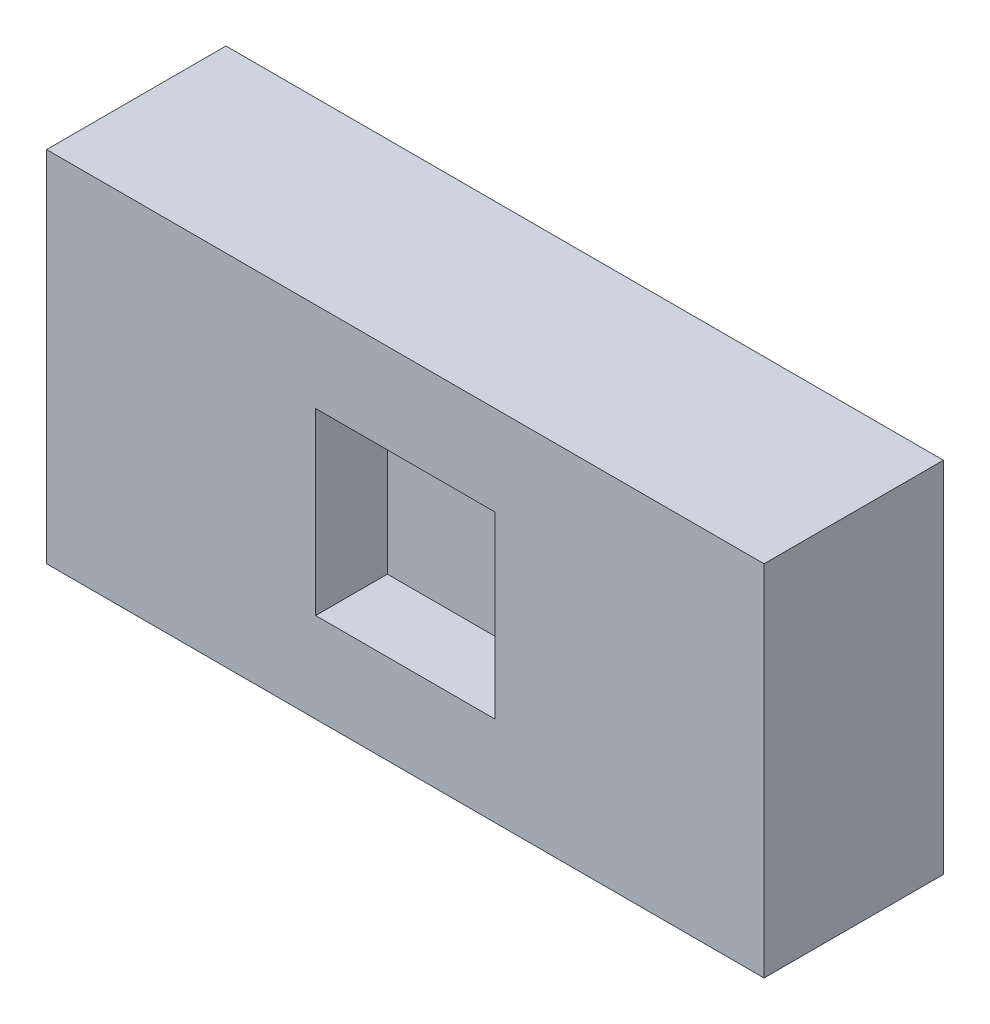
ISO-10303-21;
HEADER;
FILE_DESCRIPTION(('STEP AP214'),'2;1');
FILE_NAME('part.step','',(''),(''),'','','');
FILE_SCHEMA(('AUTOMOTIVE_DESIGN { 1 0 10303 214 1 1 1 1 }'));
ENDSEC;
DATA;
#1=APPLICATION_CONTEXT('core data for automotive mechanical design processes');
#2=APPLICATION_PROTOCOL_DEFINITION('international standard','automotive_design',2000,#1);
#3=PRODUCT_CONTEXT('',#1,'mechanical');
#4=PRODUCT('Part','Part','',(#3));
#5=PRODUCT_RELATED_PRODUCT_CATEGORY('part','',(#4));
#6=PRODUCT_DEFINITION_FORMATION('','',#4);
#7=PRODUCT_DEFINITION_CONTEXT('part definition',#1,'design');
#8=PRODUCT_DEFINITION('design','',#6,#7);
#9=PRODUCT_DEFINITION_SHAPE('','',#8);
#10=(LENGTH_UNIT() NAMED_UNIT(*) SI_UNIT(.MILLI.,.METRE.));
#11=(NAMED_UNIT(*) PLANE_ANGLE_UNIT() SI_UNIT($,.RADIAN.));
#12=(NAMED_UNIT(*) SI_UNIT($,.STERADIAN.) SOLID_ANGLE_UNIT());
#13=UNCERTAINTY_MEASURE_WITH_UNIT(LENGTH_MEASURE(1.E-05),#10,'distance_accuracy_value','');
#14=(GEOMETRIC_REPRESENTATION_CONTEXT(3) GLOBAL_UNCERTAINTY_ASSIGNED_CONTEXT((#13)) GLOBAL_UNIT_ASSIGNED_CONTEXT((#10,
#11,#12)) REPRESENTATION_CONTEXT('',''));
#15=CARTESIAN_POINT('',(0.,0.,0.));
#16=DIRECTION('',(0.,0.,1.));
#17=DIRECTION('',(1.,0.,0.));
#18=AXIS2_PLACEMENT_3D('',#15,#16,#17);
#19=CARTESIAN_POINT('',(0.,0.,10.));
#20=DIRECTION('',(1.,0.,0.));
#21=DIRECTION('',(0.,0.,-1.));
#22=AXIS2_PLACEMENT_3D('',#19,#20,#21);
#23=PLANE('',#22);
#24=DIRECTION('',(0.,-1.,0.));
#25=VECTOR('',#24,1.);
#26=CARTESIAN_POINT('',(0.,0.,0.));
#27=LINE('',#26,#25);
#28=CARTESIAN_POINT('',(0.,20.,0.));
#29=VERTEX_POINT('',#28);
#30=CARTESIAN_POINT('',(0.,0.,0.));
#31=VERTEX_POINT('',#30);
#32=EDGE_CURVE('E153',#29,#31,#27,.T.);
#33=ORIENTED_EDGE('',*,*,#32,.T.);
#34=DIRECTION('',(0.,0.,-1.));
#35=VECTOR('',#34,1.);
#36=CARTESIAN_POINT('',(0.,0.,10.));
#37=LINE('',#36,#35);
#38=CARTESIAN_POINT('',(0.,0.,10.));
#39=VERTEX_POINT('',#38);
#40=EDGE_CURVE('E11',#39,#31,#37,.T.);
#41=ORIENTED_EDGE('',*,*,#40,.F.);
#42=DIRECTION('',(0.,-1.,0.));
#43=VECTOR('',#42,1.);
#44=CARTESIAN_POINT('',(0.,0.,10.));
#45=LINE('',#44,#43);
#46=CARTESIAN_POINT('',(0.,20.,10.));
#47=VERTEX_POINT('',#46);
#48=EDGE_CURVE('E160',#47,#39,#45,.T.);
#49=ORIENTED_EDGE('',*,*,#48,.F.);
#50=DIRECTION('',(0.,0.,-1.));
#51=VECTOR('',#50,1.);
#52=CARTESIAN_POINT('',(0.,20.,10.));
#53=LINE('',#52,#51);
#54=EDGE_CURVE('E162',#47,#29,#53,.T.);
#55=ORIENTED_EDGE('',*,*,#54,.T.);
#56=EDGE_LOOP('',(#33,#41,#49,#55));
#57=FACE_BOUND('',#56,.T.);
#58=ADVANCED_FACE('F44',(#57),#23,.F.);
#59=CARTESIAN_POINT('',(0.,0.,10.));
#60=DIRECTION('',(0.,1.,0.));
#61=DIRECTION('',(0.,0.,1.));
#62=AXIS2_PLACEMENT_3D('',#59,#60,#61);
#63=PLANE('',#62);
#64=DIRECTION('',(1.,0.,0.));
#65=VECTOR('',#64,1.);
#66=CARTESIAN_POINT('',(0.,0.,0.));
#67=LINE('',#66,#65);
#68=CARTESIAN_POINT('',(40.,0.,0.));
#69=VERTEX_POINT('',#68);
#70=EDGE_CURVE('E167',#31,#69,#67,.T.);
#71=ORIENTED_EDGE('',*,*,#70,.T.);
#72=DIRECTION('',(0.,0.,-1.));
#73=VECTOR('',#72,1.);
#74=CARTESIAN_POINT('',(40.,0.,10.));
#75=LINE('',#74,#73);
#76=CARTESIAN_POINT('',(40.,0.,10.));
#77=VERTEX_POINT('',#76);
#78=EDGE_CURVE('E55',#77,#69,#75,.T.);
#79=ORIENTED_EDGE('',*,*,#78,.F.);
#80=DIRECTION('',(1.,0.,0.));
#81=VECTOR('',#80,1.);
#82=CARTESIAN_POINT('',(0.,0.,10.));
#83=LINE('',#82,#81);
#84=EDGE_CURVE('E96',#39,#77,#83,.T.);
#85=ORIENTED_EDGE('',*,*,#84,.F.);
#86=ORIENTED_EDGE('',*,*,#40,.T.);
#87=EDGE_LOOP('',(#71,#79,#85,#86));
#88=FACE_BOUND('',#87,.T.);
#89=ADVANCED_FACE('F198',(#88),#63,.F.);
#90=CARTESIAN_POINT('',(40.,0.,10.));
#91=DIRECTION('',(-1.,0.,0.));
#92=DIRECTION('',(0.,0.,1.));
#93=AXIS2_PLACEMENT_3D('',#90,#91,#92);
#94=PLANE('',#93);
#95=DIRECTION('',(0.,1.,0.));
#96=VECTOR('',#95,1.);
#97=CARTESIAN_POINT('',(40.,0.,0.));
#98=LINE('',#97,#96);
#99=CARTESIAN_POINT('',(40.,20.,0.));
#100=VERTEX_POINT('',#99);
#101=EDGE_CURVE('E169',#69,#100,#98,.T.);
#102=ORIENTED_EDGE('',*,*,#101,.T.);
#103=DIRECTION('',(0.,0.,-1.));
#104=VECTOR('',#103,1.);
#105=CARTESIAN_POINT('',(40.,20.,10.));
#106=LINE('',#105,#104);
#107=CARTESIAN_POINT('',(40.,20.,10.));
#108=VERTEX_POINT('',#107);
#109=EDGE_CURVE('E175',#108,#100,#106,.T.);
#110=ORIENTED_EDGE('',*,*,#109,.F.);
#111=DIRECTION('',(0.,1.,0.));
#112=VECTOR('',#111,1.);
#113=CARTESIAN_POINT('',(40.,0.,10.));
#114=LINE('',#113,#112);
#115=EDGE_CURVE('E159',#77,#108,#114,.T.);
#116=ORIENTED_EDGE('',*,*,#115,.F.);
#117=ORIENTED_EDGE('',*,*,#78,.T.);
#118=EDGE_LOOP('',(#102,#110,#116,#117));
#119=FACE_BOUND('',#118,.T.);
#120=ADVANCED_FACE('F177',(#119),#94,.F.);
#121=CARTESIAN_POINT('',(0.,20.,10.));
#122=DIRECTION('',(0.,-1.,0.));
#123=DIRECTION('',(0.,0.,-1.));
#124=AXIS2_PLACEMENT_3D('',#121,#122,#123);
#125=PLANE('',#124);
#126=DIRECTION('',(-1.,0.,0.));
#127=VECTOR('',#126,1.);
#128=CARTESIAN_POINT('',(0.,20.,0.));
#129=LINE('',#128,#127);
#130=EDGE_CURVE('E90',#100,#29,#129,.T.);
#131=ORIENTED_EDGE('',*,*,#130,.T.);
#132=ORIENTED_EDGE('',*,*,#54,.F.);
#133=DIRECTION('',(-1.,0.,0.));
#134=VECTOR('',#133,1.);
#135=CARTESIAN_POINT('',(0.,20.,10.));
#136=LINE('',#135,#134);
#137=EDGE_CURVE('E69',#108,#47,#136,.T.);
#138=ORIENTED_EDGE('',*,*,#137,.F.);
#139=ORIENTED_EDGE('',*,*,#109,.T.);
#140=EDGE_LOOP('',(#131,#132,#138,#139));
#141=FACE_BOUND('',#140,.T.);
#142=ADVANCED_FACE('F183',(#141),#125,.F.);
#143=CARTESIAN_POINT('',(0.,0.,10.));
#144=DIRECTION('',(0.,0.,-1.));
#145=DIRECTION('',(-1.,0.,0.));
#146=AXIS2_PLACEMENT_3D('',#143,#144,#145);
#147=PLANE('',#146);
#148=DIRECTION('',(1.,0.,0.));
#149=VECTOR('',#148,1.);
#150=CARTESIAN_POINT('',(15.,5.,10.));
#151=LINE('',#150,#149);
#152=CARTESIAN_POINT('',(15.,5.,10.));
#153=VERTEX_POINT('',#152);
#154=CARTESIAN_POINT('',(25.,5.,10.));
#155=VERTEX_POINT('',#154);
#156=EDGE_CURVE('E150',#153,#155,#151,.T.);
#157=ORIENTED_EDGE('',*,*,#156,.F.);
#158=DIRECTION('',(0.,-1.,0.));
#159=VECTOR('',#158,1.);
#160=CARTESIAN_POINT('',(15.,5.,10.));
#161=LINE('',#160,#159);
#162=CARTESIAN_POINT('',(15.,15.,10.));
#163=VERTEX_POINT('',#162);
#164=EDGE_CURVE('E56',#163,#153,#161,.T.);
#165=ORIENTED_EDGE('',*,*,#164,.F.);
#166=DIRECTION('',(-1.,0.,0.));
#167=VECTOR('',#166,1.);
#168=CARTESIAN_POINT('',(15.,15.,10.));
#169=LINE('',#168,#167);
#170=CARTESIAN_POINT('',(25.,15.,10.));
#171=VERTEX_POINT('',#170);
#172=EDGE_CURVE('E139',#171,#163,#169,.T.);
#173=ORIENTED_EDGE('',*,*,#172,.F.);
#174=DIRECTION('',(0.,1.,0.));
#175=VECTOR('',#174,1.);
#176=CARTESIAN_POINT('',(25.,5.,10.));
#177=LINE('',#176,#175);
#178=EDGE_CURVE('E143',#155,#171,#177,.T.);
#179=ORIENTED_EDGE('',*,*,#178,.F.);
#180=EDGE_LOOP('',(#157,#165,#173,#179));
#181=FACE_BOUND('',#180,.T.);
#182=ORIENTED_EDGE('',*,*,#48,.T.);
#183=ORIENTED_EDGE('',*,*,#84,.T.);
#184=ORIENTED_EDGE('',*,*,#115,.T.);
#185=ORIENTED_EDGE('',*,*,#137,.T.);
#186=EDGE_LOOP('',(#182,#183,#184,#185));
#187=FACE_BOUND('',#186,.T.);
#188=ADVANCED_FACE('F190',(#181,#187),#147,.F.);
#189=CARTESIAN_POINT('',(0.,0.,0.));
#190=DIRECTION('',(0.,0.,-1.));
#191=DIRECTION('',(-1.,0.,0.));
#192=AXIS2_PLACEMENT_3D('',#189,#190,#191);
#193=PLANE('',#192);
#194=ORIENTED_EDGE('',*,*,#32,.F.);
#195=ORIENTED_EDGE('',*,*,#130,.F.);
#196=ORIENTED_EDGE('',*,*,#101,.F.);
#197=ORIENTED_EDGE('',*,*,#70,.F.);
#198=EDGE_LOOP('',(#194,#195,#196,#197));
#199=FACE_BOUND('',#198,.T.);
#200=ADVANCED_FACE('F182',(#199),#193,.T.);
#201=CARTESIAN_POINT('',(15.,5.,6.));
#202=DIRECTION('',(-1.,0.,0.));
#203=DIRECTION('',(0.,0.,1.));
#204=AXIS2_PLACEMENT_3D('',#201,#202,#203);
#205=PLANE('',#204);
#206=ORIENTED_EDGE('',*,*,#164,.T.);
#207=DIRECTION('',(0.,0.,1.));
#208=VECTOR('',#207,1.);
#209=CARTESIAN_POINT('',(15.,5.,6.));
#210=LINE('',#209,#208);
#211=CARTESIAN_POINT('',(15.,5.,6.));
#212=VERTEX_POINT('',#211);
#213=EDGE_CURVE('E118',#212,#153,#210,.T.);
#214=ORIENTED_EDGE('',*,*,#213,.F.);
#215=DIRECTION('',(0.,-1.,0.));
#216=VECTOR('',#215,1.);
#217=CARTESIAN_POINT('',(15.,5.,6.));
#218=LINE('',#217,#216);
#219=CARTESIAN_POINT('',(15.,15.,6.));
#220=VERTEX_POINT('',#219);
#221=EDGE_CURVE('E117',#220,#212,#218,.T.);
#222=ORIENTED_EDGE('',*,*,#221,.F.);
#223=DIRECTION('',(0.,0.,1.));
#224=VECTOR('',#223,1.);
#225=CARTESIAN_POINT('',(15.,15.,6.));
#226=LINE('',#225,#224);
#227=EDGE_CURVE('E151',#220,#163,#226,.T.);
#228=ORIENTED_EDGE('',*,*,#227,.T.);
#229=EDGE_LOOP('',(#206,#214,#222,#228));
#230=FACE_BOUND('',#229,.T.);
#231=ADVANCED_FACE('F116',(#230),#205,.F.);
#232=CARTESIAN_POINT('',(15.,15.,6.));
#233=DIRECTION('',(0.,1.,0.));
#234=DIRECTION('',(0.,0.,1.));
#235=AXIS2_PLACEMENT_3D('',#232,#233,#234);
#236=PLANE('',#235);
#237=ORIENTED_EDGE('',*,*,#172,.T.);
#238=ORIENTED_EDGE('',*,*,#227,.F.);
#239=DIRECTION('',(-1.,0.,0.));
#240=VECTOR('',#239,1.);
#241=CARTESIAN_POINT('',(15.,15.,6.));
#242=LINE('',#241,#240);
#243=CARTESIAN_POINT('',(25.,15.,6.));
#244=VERTEX_POINT('',#243);
#245=EDGE_CURVE('E127',#244,#220,#242,.T.);
#246=ORIENTED_EDGE('',*,*,#245,.F.);
#247=DIRECTION('',(0.,0.,1.));
#248=VECTOR('',#247,1.);
#249=CARTESIAN_POINT('',(25.,15.,6.));
#250=LINE('',#249,#248);
#251=EDGE_CURVE('E152',#244,#171,#250,.T.);
#252=ORIENTED_EDGE('',*,*,#251,.T.);
#253=EDGE_LOOP('',(#237,#238,#246,#252));
#254=FACE_BOUND('',#253,.T.);
#255=ADVANCED_FACE('F240',(#254),#236,.F.);
#256=CARTESIAN_POINT('',(25.,5.,6.));
#257=DIRECTION('',(1.,0.,0.));
#258=DIRECTION('',(0.,0.,-1.));
#259=AXIS2_PLACEMENT_3D('',#256,#257,#258);
#260=PLANE('',#259);
#261=ORIENTED_EDGE('',*,*,#178,.T.);
#262=ORIENTED_EDGE('',*,*,#251,.F.);
#263=DIRECTION('',(0.,1.,0.));
#264=VECTOR('',#263,1.);
#265=CARTESIAN_POINT('',(25.,5.,6.));
#266=LINE('',#265,#264);
#267=CARTESIAN_POINT('',(25.,5.,6.));
#268=VERTEX_POINT('',#267);
#269=EDGE_CURVE('E134',#268,#244,#266,.T.);
#270=ORIENTED_EDGE('',*,*,#269,.F.);
#271=DIRECTION('',(0.,0.,1.));
#272=VECTOR('',#271,1.);
#273=CARTESIAN_POINT('',(25.,5.,6.));
#274=LINE('',#273,#272);
#275=EDGE_CURVE('E125',#268,#155,#274,.T.);
#276=ORIENTED_EDGE('',*,*,#275,.T.);
#277=EDGE_LOOP('',(#261,#262,#270,#276));
#278=FACE_BOUND('',#277,.T.);
#279=ADVANCED_FACE('F246',(#278),#260,.F.);
#280=CARTESIAN_POINT('',(15.,5.,6.));
#281=DIRECTION('',(0.,-1.,0.));
#282=DIRECTION('',(0.,0.,-1.));
#283=AXIS2_PLACEMENT_3D('',#280,#281,#282);
#284=PLANE('',#283);
#285=ORIENTED_EDGE('',*,*,#156,.T.);
#286=ORIENTED_EDGE('',*,*,#275,.F.);
#287=DIRECTION('',(1.,0.,0.));
#288=VECTOR('',#287,1.);
#289=CARTESIAN_POINT('',(15.,5.,6.));
#290=LINE('',#289,#288);
#291=EDGE_CURVE('E129',#212,#268,#290,.T.);
#292=ORIENTED_EDGE('',*,*,#291,.F.);
#293=ORIENTED_EDGE('',*,*,#213,.T.);
#294=EDGE_LOOP('',(#285,#286,#292,#293));
#295=FACE_BOUND('',#294,.T.);
#296=ADVANCED_FACE('F128',(#295),#284,.F.);
#297=CARTESIAN_POINT('',(0.,0.,6.));
#298=DIRECTION('',(0.,0.,-1.));
#299=DIRECTION('',(-1.,0.,0.));
#300=AXIS2_PLACEMENT_3D('',#297,#298,#299);
#301=PLANE('',#300);
#302=ORIENTED_EDGE('',*,*,#221,.T.);
#303=ORIENTED_EDGE('',*,*,#291,.T.);
#304=ORIENTED_EDGE('',*,*,#269,.T.);
#305=ORIENTED_EDGE('',*,*,#245,.T.);
#306=EDGE_LOOP('',(#302,#303,#304,#305));
#307=FACE_BOUND('',#306,.T.);
#308=ADVANCED_FACE('F136',(#307),#301,.F.);
#309=CLOSED_SHELL('',(#58,#89,#120,#142,#188,#200,#231,#255,#279,#296,#308));
#310=MANIFOLD_SOLID_BREP('B2',#309);
#311=ADVANCED_BREP_SHAPE_REPRESENTATION('',(#18,#310),#14);
#312=SHAPE_DEFINITION_REPRESENTATION(#9,#311);
ENDSEC;
END-ISO-10303-21;
